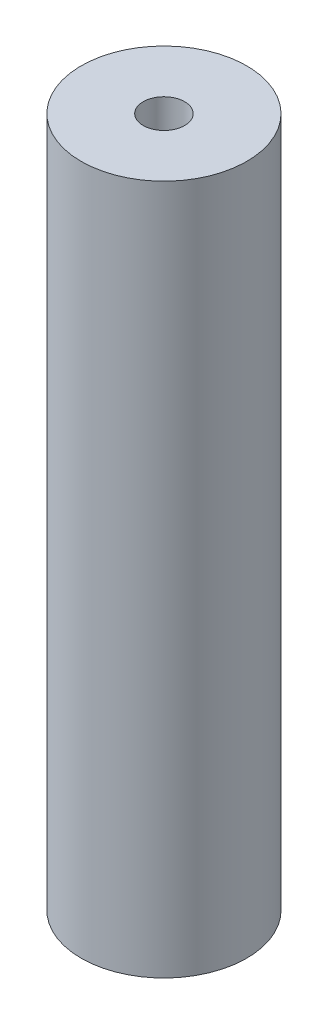
ISO-10303-21;
HEADER;
FILE_DESCRIPTION(('STEP AP214'),'2;1');
FILE_NAME('part.step','',(''),(''),'','','');
FILE_SCHEMA(('AUTOMOTIVE_DESIGN { 1 0 10303 214 1 1 1 1 }'));
ENDSEC;
DATA;
#1=APPLICATION_CONTEXT('core data for automotive mechanical design processes');
#2=APPLICATION_PROTOCOL_DEFINITION('international standard','automotive_design',2000,#1);
#3=PRODUCT_CONTEXT('',#1,'mechanical');
#4=PRODUCT('Part','Part','',(#3));
#5=PRODUCT_RELATED_PRODUCT_CATEGORY('part','',(#4));
#6=PRODUCT_DEFINITION_FORMATION('','',#4);
#7=PRODUCT_DEFINITION_CONTEXT('part definition',#1,'design');
#8=PRODUCT_DEFINITION('design','',#6,#7);
#9=PRODUCT_DEFINITION_SHAPE('','',#8);
#10=(LENGTH_UNIT() NAMED_UNIT(*) SI_UNIT(.MILLI.,.METRE.));
#11=(NAMED_UNIT(*) PLANE_ANGLE_UNIT() SI_UNIT($,.RADIAN.));
#12=(NAMED_UNIT(*) SI_UNIT($,.STERADIAN.) SOLID_ANGLE_UNIT());
#13=UNCERTAINTY_MEASURE_WITH_UNIT(LENGTH_MEASURE(1.E-05),#10,'distance_accuracy_value','');
#14=(GEOMETRIC_REPRESENTATION_CONTEXT(3) GLOBAL_UNCERTAINTY_ASSIGNED_CONTEXT((#13)) GLOBAL_UNIT_ASSIGNED_CONTEXT((#10,
#11,#12)) REPRESENTATION_CONTEXT('',''));
#15=CARTESIAN_POINT('',(0.,0.,0.));
#16=DIRECTION('',(0.,0.,1.));
#17=DIRECTION('',(1.,0.,0.));
#18=AXIS2_PLACEMENT_3D('',#15,#16,#17);
#19=CARTESIAN_POINT('',(0.,50.,0.));
#20=DIRECTION('',(0.,-1.,0.));
#21=DIRECTION('',(0.,0.,-1.));
#22=AXIS2_PLACEMENT_3D('',#19,#20,#21);
#23=CYLINDRICAL_SURFACE('',#22,6.);
#24=CARTESIAN_POINT('',(0.,50.,0.));
#25=DIRECTION('',(0.,1.,0.));
#26=DIRECTION('',(0.,0.,1.));
#27=AXIS2_PLACEMENT_3D('',#24,#25,#26);
#28=CIRCLE('',#27,6.);
#29=CARTESIAN_POINT('',(0.,50.,6.));
#30=VERTEX_POINT('',#29);
#31=EDGE_CURVE('E11',#30,#30,#28,.T.);
#32=ORIENTED_EDGE('',*,*,#31,.F.);
#33=EDGE_LOOP('',(#32));
#34=FACE_BOUND('',#33,.T.);
#35=CARTESIAN_POINT('',(0.,0.,0.));
#36=DIRECTION('',(0.,1.,0.));
#37=DIRECTION('',(0.,0.,1.));
#38=AXIS2_PLACEMENT_3D('',#35,#36,#37);
#39=CIRCLE('',#38,6.);
#40=CARTESIAN_POINT('',(0.,0.,6.));
#41=VERTEX_POINT('',#40);
#42=EDGE_CURVE('E35',#41,#41,#39,.T.);
#43=ORIENTED_EDGE('',*,*,#42,.T.);
#44=EDGE_LOOP('',(#43));
#45=FACE_BOUND('',#44,.T.);
#46=ADVANCED_FACE('F32',(#34,#45),#23,.T.);
#47=CARTESIAN_POINT('',(0.,50.,0.));
#48=DIRECTION('',(0.,1.,0.));
#49=DIRECTION('',(0.,0.,1.));
#50=AXIS2_PLACEMENT_3D('',#47,#48,#49);
#51=PLANE('',#50);
#52=CARTESIAN_POINT('',(0.,50.,0.));
#53=DIRECTION('',(0.,1.,0.));
#54=DIRECTION('',(0.,0.,1.));
#55=AXIS2_PLACEMENT_3D('',#52,#53,#54);
#56=CIRCLE('',#55,1.50000004799999);
#57=CARTESIAN_POINT('',(0.,50.,1.50000004799999));
#58=VERTEX_POINT('',#57);
#59=EDGE_CURVE('E51',#58,#58,#56,.T.);
#60=ORIENTED_EDGE('',*,*,#59,.F.);
#61=EDGE_LOOP('',(#60));
#62=FACE_BOUND('',#61,.T.);
#63=ORIENTED_EDGE('',*,*,#31,.T.);
#64=EDGE_LOOP('',(#63));
#65=FACE_BOUND('',#64,.T.);
#66=ADVANCED_FACE('F59',(#62,#65),#51,.T.);
#67=CARTESIAN_POINT('',(0.,0.,0.));
#68=DIRECTION('',(0.,1.,0.));
#69=DIRECTION('',(0.,0.,1.));
#70=AXIS2_PLACEMENT_3D('',#67,#68,#69);
#71=PLANE('',#70);
#72=ORIENTED_EDGE('',*,*,#42,.F.);
#73=EDGE_LOOP('',(#72));
#74=FACE_BOUND('',#73,.T.);
#75=ADVANCED_FACE('F45',(#74),#71,.F.);
#76=CARTESIAN_POINT('',(0.,40.,0.));
#77=DIRECTION('',(0.,1.,0.));
#78=DIRECTION('',(0.,0.,1.));
#79=AXIS2_PLACEMENT_3D('',#76,#77,#78);
#80=CONICAL_SURFACE('',#79,1.50000004799999,1.02974425867665);
#81=CARTESIAN_POINT('',(0.,39.0987090426174,0.));
#82=VERTEX_POINT('',#81);
#83=VERTEX_LOOP('',#82);
#84=FACE_BOUND('',#83,.T.);
#85=CARTESIAN_POINT('',(0.,40.,0.));
#86=DIRECTION('',(0.,1.,0.));
#87=DIRECTION('',(0.,0.,1.));
#88=AXIS2_PLACEMENT_3D('',#85,#86,#87);
#89=CIRCLE('',#88,1.50000004799999);
#90=CARTESIAN_POINT('',(0.,40.,1.50000004799999));
#91=VERTEX_POINT('',#90);
#92=EDGE_CURVE('E49',#91,#91,#89,.T.);
#93=ORIENTED_EDGE('',*,*,#92,.T.);
#94=EDGE_LOOP('',(#93));
#95=FACE_BOUND('',#94,.T.);
#96=ADVANCED_FACE('F41',(#84,#95),#80,.F.);
#97=CARTESIAN_POINT('',(0.,50.,0.));
#98=DIRECTION('',(0.,1.,0.));
#99=DIRECTION('',(0.,0.,1.));
#100=AXIS2_PLACEMENT_3D('',#97,#98,#99);
#101=CYLINDRICAL_SURFACE('',#100,1.50000004799999);
#102=ORIENTED_EDGE('',*,*,#92,.F.);
#103=EDGE_LOOP('',(#102));
#104=FACE_BOUND('',#103,.T.);
#105=ORIENTED_EDGE('',*,*,#59,.T.);
#106=EDGE_LOOP('',(#105));
#107=FACE_BOUND('',#106,.T.);
#108=ADVANCED_FACE('F44',(#104,#107),#101,.F.);
#109=CLOSED_SHELL('',(#46,#66,#75,#96,#108));
#110=MANIFOLD_SOLID_BREP('B2',#109);
#111=ADVANCED_BREP_SHAPE_REPRESENTATION('',(#18,#110),#14);
#112=SHAPE_DEFINITION_REPRESENTATION(#9,#111);
ENDSEC;
END-ISO-10303-21;
